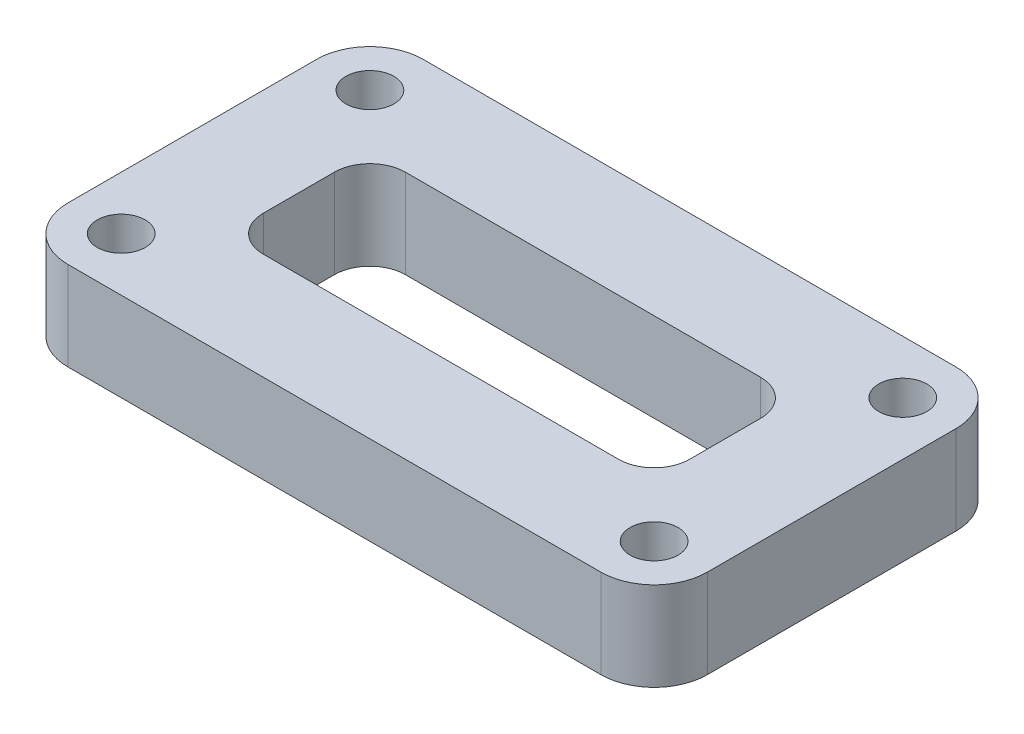
ISO-10303-21;
HEADER;
FILE_DESCRIPTION(('STEP AP214'),'2;1');
FILE_NAME('part.step','',(''),(''),'','','');
FILE_SCHEMA(('AUTOMOTIVE_DESIGN { 1 0 10303 214 1 1 1 1 }'));
ENDSEC;
DATA;
#1=APPLICATION_CONTEXT('core data for automotive mechanical design processes');
#2=APPLICATION_PROTOCOL_DEFINITION('international standard','automotive_design',2000,#1);
#3=PRODUCT_CONTEXT('',#1,'mechanical');
#4=PRODUCT('Part','Part','',(#3));
#5=PRODUCT_RELATED_PRODUCT_CATEGORY('part','',(#4));
#6=PRODUCT_DEFINITION_FORMATION('','',#4);
#7=PRODUCT_DEFINITION_CONTEXT('part definition',#1,'design');
#8=PRODUCT_DEFINITION('design','',#6,#7);
#9=PRODUCT_DEFINITION_SHAPE('','',#8);
#10=(LENGTH_UNIT() NAMED_UNIT(*) SI_UNIT(.MILLI.,.METRE.));
#11=(NAMED_UNIT(*) PLANE_ANGLE_UNIT() SI_UNIT($,.RADIAN.));
#12=(NAMED_UNIT(*) SI_UNIT($,.STERADIAN.) SOLID_ANGLE_UNIT());
#13=UNCERTAINTY_MEASURE_WITH_UNIT(LENGTH_MEASURE(1.E-05),#10,'distance_accuracy_value','');
#14=(GEOMETRIC_REPRESENTATION_CONTEXT(3) GLOBAL_UNCERTAINTY_ASSIGNED_CONTEXT((#13)) GLOBAL_UNIT_ASSIGNED_CONTEXT((#10,
#11,#12)) REPRESENTATION_CONTEXT('',''));
#15=CARTESIAN_POINT('',(0.,0.,0.));
#16=DIRECTION('',(0.,0.,1.));
#17=DIRECTION('',(1.,0.,0.));
#18=AXIS2_PLACEMENT_3D('',#15,#16,#17);
#19=CARTESIAN_POINT('',(0.,5.,0.));
#20=DIRECTION('',(0.,-1.,0.));
#21=DIRECTION('',(0.,0.,-1.));
#22=AXIS2_PLACEMENT_3D('',#19,#20,#21);
#23=PLANE('',#22);
#24=CARTESIAN_POINT('',(3.,5.,-3.));
#25=DIRECTION('',(0.,1.,0.));
#26=DIRECTION('',(0.,0.,-1.));
#27=AXIS2_PLACEMENT_3D('',#24,#25,#26);
#28=CIRCLE('',#27,1.35);
#29=CARTESIAN_POINT('',(3.,5.,-4.35));
#30=VERTEX_POINT('',#29);
#31=EDGE_CURVE('E286',#30,#30,#28,.T.);
#32=ORIENTED_EDGE('',*,*,#31,.F.);
#33=EDGE_LOOP('',(#32));
#34=FACE_BOUND('',#33,.T.);
#35=CARTESIAN_POINT('',(33.,5.,-3.));
#36=DIRECTION('',(0.,1.,0.));
#37=DIRECTION('',(0.,0.,1.));
#38=AXIS2_PLACEMENT_3D('',#35,#36,#37);
#39=CIRCLE('',#38,1.35);
#40=CARTESIAN_POINT('',(33.,5.,-1.65));
#41=VERTEX_POINT('',#40);
#42=EDGE_CURVE('E292',#41,#41,#39,.T.);
#43=ORIENTED_EDGE('',*,*,#42,.F.);
#44=EDGE_LOOP('',(#43));
#45=FACE_BOUND('',#44,.T.);
#46=CARTESIAN_POINT('',(33.,5.,-17.));
#47=DIRECTION('',(0.,1.,0.));
#48=DIRECTION('',(0.,0.,-1.));
#49=AXIS2_PLACEMENT_3D('',#46,#47,#48);
#50=CIRCLE('',#49,1.35);
#51=CARTESIAN_POINT('',(33.,5.,-18.35));
#52=VERTEX_POINT('',#51);
#53=EDGE_CURVE('E298',#52,#52,#50,.T.);
#54=ORIENTED_EDGE('',*,*,#53,.F.);
#55=EDGE_LOOP('',(#54));
#56=FACE_BOUND('',#55,.T.);
#57=CARTESIAN_POINT('',(3.,5.,-17.));
#58=DIRECTION('',(0.,1.,0.));
#59=DIRECTION('',(0.,0.,1.));
#60=AXIS2_PLACEMENT_3D('',#57,#58,#59);
#61=CIRCLE('',#60,1.35);
#62=CARTESIAN_POINT('',(3.,5.,-15.65));
#63=VERTEX_POINT('',#62);
#64=EDGE_CURVE('E179',#63,#63,#61,.T.);
#65=ORIENTED_EDGE('',*,*,#64,.F.);
#66=EDGE_LOOP('',(#65));
#67=FACE_BOUND('',#66,.T.);
#68=DIRECTION('',(-1.,0.,0.));
#69=VECTOR('',#68,1.);
#70=CARTESIAN_POINT('',(0.,5.,-20.));
#71=LINE('',#70,#69);
#72=CARTESIAN_POINT('',(33.,5.,-20.));
#73=VERTEX_POINT('',#72);
#74=CARTESIAN_POINT('',(3.,5.,-20.));
#75=VERTEX_POINT('',#74);
#76=EDGE_CURVE('E188',#73,#75,#71,.T.);
#77=ORIENTED_EDGE('',*,*,#76,.T.);
#78=CARTESIAN_POINT('',(3.,5.,-17.));
#79=DIRECTION('',(0.,-1.,0.));
#80=DIRECTION('',(0.,0.,-1.));
#81=AXIS2_PLACEMENT_3D('',#78,#79,#80);
#82=CIRCLE('',#81,3.);
#83=CARTESIAN_POINT('',(0.,5.,-17.));
#84=VERTEX_POINT('',#83);
#85=EDGE_CURVE('E209',#75,#84,#82,.F.);
#86=ORIENTED_EDGE('',*,*,#85,.T.);
#87=DIRECTION('',(0.,0.,1.));
#88=VECTOR('',#87,1.);
#89=CARTESIAN_POINT('',(0.,5.,0.));
#90=LINE('',#89,#88);
#91=CARTESIAN_POINT('',(0.,5.,-3.));
#92=VERTEX_POINT('',#91);
#93=EDGE_CURVE('E171',#84,#92,#90,.T.);
#94=ORIENTED_EDGE('',*,*,#93,.T.);
#95=CARTESIAN_POINT('',(3.,5.,-3.));
#96=DIRECTION('',(0.,-1.,0.));
#97=DIRECTION('',(0.,0.,-1.));
#98=AXIS2_PLACEMENT_3D('',#95,#96,#97);
#99=CIRCLE('',#98,3.);
#100=CARTESIAN_POINT('',(3.,5.,0.));
#101=VERTEX_POINT('',#100);
#102=EDGE_CURVE('E203',#92,#101,#99,.F.);
#103=ORIENTED_EDGE('',*,*,#102,.T.);
#104=DIRECTION('',(1.,0.,0.));
#105=VECTOR('',#104,1.);
#106=CARTESIAN_POINT('',(0.,5.,0.));
#107=LINE('',#106,#105);
#108=CARTESIAN_POINT('',(33.,5.,0.));
#109=VERTEX_POINT('',#108);
#110=EDGE_CURVE('E306',#101,#109,#107,.T.);
#111=ORIENTED_EDGE('',*,*,#110,.T.);
#112=CARTESIAN_POINT('',(33.,5.,-3.));
#113=DIRECTION('',(0.,-1.,0.));
#114=DIRECTION('',(0.,0.,-1.));
#115=AXIS2_PLACEMENT_3D('',#112,#113,#114);
#116=CIRCLE('',#115,3.);
#117=CARTESIAN_POINT('',(36.,5.,-3.));
#118=VERTEX_POINT('',#117);
#119=EDGE_CURVE('E205',#109,#118,#116,.F.);
#120=ORIENTED_EDGE('',*,*,#119,.T.);
#121=DIRECTION('',(0.,0.,-1.));
#122=VECTOR('',#121,1.);
#123=CARTESIAN_POINT('',(36.,5.,0.));
#124=LINE('',#123,#122);
#125=CARTESIAN_POINT('',(36.,5.,-17.));
#126=VERTEX_POINT('',#125);
#127=EDGE_CURVE('E308',#118,#126,#124,.T.);
#128=ORIENTED_EDGE('',*,*,#127,.T.);
#129=CARTESIAN_POINT('',(33.,5.,-17.));
#130=DIRECTION('',(0.,-1.,0.));
#131=DIRECTION('',(0.,0.,-1.));
#132=AXIS2_PLACEMENT_3D('',#129,#130,#131);
#133=CIRCLE('',#132,3.);
#134=EDGE_CURVE('E207',#126,#73,#133,.F.);
#135=ORIENTED_EDGE('',*,*,#134,.T.);
#136=EDGE_LOOP('',(#77,#86,#94,#103,#111,#120,#128,#135));
#137=FACE_BOUND('',#136,.T.);
#138=DIRECTION('',(1.,0.,0.));
#139=VECTOR('',#138,1.);
#140=CARTESIAN_POINT('',(6.,5.,-6.));
#141=LINE('',#140,#139);
#142=CARTESIAN_POINT('',(8.,5.,-6.));
#143=VERTEX_POINT('',#142);
#144=CARTESIAN_POINT('',(28.,5.,-6.));
#145=VERTEX_POINT('',#144);
#146=EDGE_CURVE('E260',#143,#145,#141,.T.);
#147=ORIENTED_EDGE('',*,*,#146,.F.);
#148=CARTESIAN_POINT('',(8.,5.,-8.));
#149=DIRECTION('',(0.,-1.,0.));
#150=DIRECTION('',(0.,0.,-1.));
#151=AXIS2_PLACEMENT_3D('',#148,#149,#150);
#152=CIRCLE('',#151,2.);
#153=CARTESIAN_POINT('',(6.,5.,-8.));
#154=VERTEX_POINT('',#153);
#155=EDGE_CURVE('E52',#143,#154,#152,.T.);
#156=ORIENTED_EDGE('',*,*,#155,.T.);
#157=DIRECTION('',(0.,0.,1.));
#158=VECTOR('',#157,1.);
#159=CARTESIAN_POINT('',(6.,5.,-6.));
#160=LINE('',#159,#158);
#161=CARTESIAN_POINT('',(6.,5.,-12.));
#162=VERTEX_POINT('',#161);
#163=EDGE_CURVE('E267',#162,#154,#160,.T.);
#164=ORIENTED_EDGE('',*,*,#163,.F.);
#165=CARTESIAN_POINT('',(8.,5.,-12.));
#166=DIRECTION('',(0.,-1.,0.));
#167=DIRECTION('',(0.,0.,-1.));
#168=AXIS2_PLACEMENT_3D('',#165,#166,#167);
#169=CIRCLE('',#168,2.);
#170=CARTESIAN_POINT('',(8.,5.,-14.));
#171=VERTEX_POINT('',#170);
#172=EDGE_CURVE('E11',#162,#171,#169,.T.);
#173=ORIENTED_EDGE('',*,*,#172,.T.);
#174=DIRECTION('',(-1.,0.,0.));
#175=VECTOR('',#174,1.);
#176=CARTESIAN_POINT('',(6.,5.,-14.));
#177=LINE('',#176,#175);
#178=CARTESIAN_POINT('',(28.,5.,-14.));
#179=VERTEX_POINT('',#178);
#180=EDGE_CURVE('E265',#179,#171,#177,.T.);
#181=ORIENTED_EDGE('',*,*,#180,.F.);
#182=CARTESIAN_POINT('',(28.,5.,-12.));
#183=DIRECTION('',(0.,-1.,0.));
#184=DIRECTION('',(0.,0.,-1.));
#185=AXIS2_PLACEMENT_3D('',#182,#183,#184);
#186=CIRCLE('',#185,2.);
#187=CARTESIAN_POINT('',(30.,5.,-12.));
#188=VERTEX_POINT('',#187);
#189=EDGE_CURVE('E246',#179,#188,#186,.T.);
#190=ORIENTED_EDGE('',*,*,#189,.T.);
#191=DIRECTION('',(0.,0.,-1.));
#192=VECTOR('',#191,1.);
#193=CARTESIAN_POINT('',(30.,5.,-6.));
#194=LINE('',#193,#192);
#195=CARTESIAN_POINT('',(30.,5.,-8.));
#196=VERTEX_POINT('',#195);
#197=EDGE_CURVE('E271',#196,#188,#194,.T.);
#198=ORIENTED_EDGE('',*,*,#197,.F.);
#199=CARTESIAN_POINT('',(28.,5.,-8.));
#200=DIRECTION('',(0.,-1.,0.));
#201=DIRECTION('',(0.,0.,-1.));
#202=AXIS2_PLACEMENT_3D('',#199,#200,#201);
#203=CIRCLE('',#202,2.);
#204=EDGE_CURVE('E242',#196,#145,#203,.T.);
#205=ORIENTED_EDGE('',*,*,#204,.T.);
#206=EDGE_LOOP('',(#147,#156,#164,#173,#181,#190,#198,#205));
#207=FACE_BOUND('',#206,.T.);
#208=ADVANCED_FACE('F37',(#34,#45,#56,#67,#137,#207),#23,.F.);
#209=CARTESIAN_POINT('',(0.,0.,0.));
#210=DIRECTION('',(0.,-1.,0.));
#211=DIRECTION('',(0.,0.,-1.));
#212=AXIS2_PLACEMENT_3D('',#209,#210,#211);
#213=PLANE('',#212);
#214=CARTESIAN_POINT('',(33.,0.,-3.));
#215=DIRECTION('',(0.,1.,0.));
#216=DIRECTION('',(0.,0.,1.));
#217=AXIS2_PLACEMENT_3D('',#214,#215,#216);
#218=CIRCLE('',#217,1.35);
#219=CARTESIAN_POINT('',(33.,0.,-1.65));
#220=VERTEX_POINT('',#219);
#221=EDGE_CURVE('E289',#220,#220,#218,.T.);
#222=ORIENTED_EDGE('',*,*,#221,.T.);
#223=EDGE_LOOP('',(#222));
#224=FACE_BOUND('',#223,.T.);
#225=CARTESIAN_POINT('',(3.,0.,-17.));
#226=DIRECTION('',(0.,1.,0.));
#227=DIRECTION('',(0.,0.,1.));
#228=AXIS2_PLACEMENT_3D('',#225,#226,#227);
#229=CIRCLE('',#228,1.35);
#230=CARTESIAN_POINT('',(3.,0.,-15.65));
#231=VERTEX_POINT('',#230);
#232=EDGE_CURVE('E185',#231,#231,#229,.T.);
#233=ORIENTED_EDGE('',*,*,#232,.T.);
#234=EDGE_LOOP('',(#233));
#235=FACE_BOUND('',#234,.T.);
#236=DIRECTION('',(0.,0.,1.));
#237=VECTOR('',#236,1.);
#238=CARTESIAN_POINT('',(0.,0.,0.));
#239=LINE('',#238,#237);
#240=CARTESIAN_POINT('',(0.,0.,-17.));
#241=VERTEX_POINT('',#240);
#242=CARTESIAN_POINT('',(0.,0.,-3.));
#243=VERTEX_POINT('',#242);
#244=EDGE_CURVE('E168',#241,#243,#239,.T.);
#245=ORIENTED_EDGE('',*,*,#244,.F.);
#246=CARTESIAN_POINT('',(3.,0.,-17.));
#247=DIRECTION('',(0.,-1.,0.));
#248=DIRECTION('',(0.,0.,-1.));
#249=AXIS2_PLACEMENT_3D('',#246,#247,#248);
#250=CIRCLE('',#249,3.);
#251=CARTESIAN_POINT('',(3.,0.,-20.));
#252=VERTEX_POINT('',#251);
#253=EDGE_CURVE('E151',#241,#252,#250,.T.);
#254=ORIENTED_EDGE('',*,*,#253,.T.);
#255=DIRECTION('',(-1.,0.,0.));
#256=VECTOR('',#255,1.);
#257=CARTESIAN_POINT('',(0.,0.,-20.));
#258=LINE('',#257,#256);
#259=CARTESIAN_POINT('',(33.,0.,-20.));
#260=VERTEX_POINT('',#259);
#261=EDGE_CURVE('E193',#260,#252,#258,.T.);
#262=ORIENTED_EDGE('',*,*,#261,.F.);
#263=CARTESIAN_POINT('',(33.,0.,-17.));
#264=DIRECTION('',(0.,-1.,0.));
#265=DIRECTION('',(0.,0.,-1.));
#266=AXIS2_PLACEMENT_3D('',#263,#264,#265);
#267=CIRCLE('',#266,3.);
#268=CARTESIAN_POINT('',(36.,0.,-17.));
#269=VERTEX_POINT('',#268);
#270=EDGE_CURVE('E162',#260,#269,#267,.T.);
#271=ORIENTED_EDGE('',*,*,#270,.T.);
#272=DIRECTION('',(0.,0.,-1.));
#273=VECTOR('',#272,1.);
#274=CARTESIAN_POINT('',(36.,0.,0.));
#275=LINE('',#274,#273);
#276=CARTESIAN_POINT('',(36.,0.,-3.));
#277=VERTEX_POINT('',#276);
#278=EDGE_CURVE('E182',#277,#269,#275,.T.);
#279=ORIENTED_EDGE('',*,*,#278,.F.);
#280=CARTESIAN_POINT('',(33.,0.,-3.));
#281=DIRECTION('',(0.,-1.,0.));
#282=DIRECTION('',(0.,0.,-1.));
#283=AXIS2_PLACEMENT_3D('',#280,#281,#282);
#284=CIRCLE('',#283,3.);
#285=CARTESIAN_POINT('',(33.,0.,0.));
#286=VERTEX_POINT('',#285);
#287=EDGE_CURVE('E197',#277,#286,#284,.T.);
#288=ORIENTED_EDGE('',*,*,#287,.T.);
#289=DIRECTION('',(1.,0.,0.));
#290=VECTOR('',#289,1.);
#291=CARTESIAN_POINT('',(0.,0.,0.));
#292=LINE('',#291,#290);
#293=CARTESIAN_POINT('',(3.,0.,0.));
#294=VERTEX_POINT('',#293);
#295=EDGE_CURVE('E178',#294,#286,#292,.T.);
#296=ORIENTED_EDGE('',*,*,#295,.F.);
#297=CARTESIAN_POINT('',(3.,0.,-3.));
#298=DIRECTION('',(0.,-1.,0.));
#299=DIRECTION('',(0.,0.,-1.));
#300=AXIS2_PLACEMENT_3D('',#297,#298,#299);
#301=CIRCLE('',#300,3.);
#302=EDGE_CURVE('E172',#294,#243,#301,.T.);
#303=ORIENTED_EDGE('',*,*,#302,.T.);
#304=EDGE_LOOP('',(#245,#254,#262,#271,#279,#288,#296,#303));
#305=FACE_BOUND('',#304,.T.);
#306=CARTESIAN_POINT('',(33.,0.,-17.));
#307=DIRECTION('',(0.,1.,0.));
#308=DIRECTION('',(0.,0.,-1.));
#309=AXIS2_PLACEMENT_3D('',#306,#307,#308);
#310=CIRCLE('',#309,1.35);
#311=CARTESIAN_POINT('',(33.,0.,-18.35));
#312=VERTEX_POINT('',#311);
#313=EDGE_CURVE('E295',#312,#312,#310,.T.);
#314=ORIENTED_EDGE('',*,*,#313,.T.);
#315=EDGE_LOOP('',(#314));
#316=FACE_BOUND('',#315,.T.);
#317=CARTESIAN_POINT('',(3.,0.,-3.));
#318=DIRECTION('',(0.,1.,0.));
#319=DIRECTION('',(0.,0.,-1.));
#320=AXIS2_PLACEMENT_3D('',#317,#318,#319);
#321=CIRCLE('',#320,1.35);
#322=CARTESIAN_POINT('',(3.,0.,-4.35));
#323=VERTEX_POINT('',#322);
#324=EDGE_CURVE('E273',#323,#323,#321,.T.);
#325=ORIENTED_EDGE('',*,*,#324,.T.);
#326=EDGE_LOOP('',(#325));
#327=FACE_BOUND('',#326,.T.);
#328=DIRECTION('',(-1.,0.,0.));
#329=VECTOR('',#328,1.);
#330=CARTESIAN_POINT('',(6.,0.,-14.));
#331=LINE('',#330,#329);
#332=CARTESIAN_POINT('',(28.,0.,-14.));
#333=VERTEX_POINT('',#332);
#334=CARTESIAN_POINT('',(8.,0.,-14.));
#335=VERTEX_POINT('',#334);
#336=EDGE_CURVE('E255',#333,#335,#331,.T.);
#337=ORIENTED_EDGE('',*,*,#336,.T.);
#338=CARTESIAN_POINT('',(8.,0.,-12.));
#339=DIRECTION('',(0.,-1.,0.));
#340=DIRECTION('',(0.,0.,-1.));
#341=AXIS2_PLACEMENT_3D('',#338,#339,#340);
#342=CIRCLE('',#341,2.);
#343=CARTESIAN_POINT('',(6.,0.,-12.));
#344=VERTEX_POINT('',#343);
#345=EDGE_CURVE('E45',#335,#344,#342,.F.);
#346=ORIENTED_EDGE('',*,*,#345,.T.);
#347=DIRECTION('',(0.,0.,1.));
#348=VECTOR('',#347,1.);
#349=CARTESIAN_POINT('',(6.,0.,-6.));
#350=LINE('',#349,#348);
#351=CARTESIAN_POINT('',(6.,0.,-8.));
#352=VERTEX_POINT('',#351);
#353=EDGE_CURVE('E253',#344,#352,#350,.T.);
#354=ORIENTED_EDGE('',*,*,#353,.T.);
#355=CARTESIAN_POINT('',(8.,0.,-8.));
#356=DIRECTION('',(0.,-1.,0.));
#357=DIRECTION('',(0.,0.,-1.));
#358=AXIS2_PLACEMENT_3D('',#355,#356,#357);
#359=CIRCLE('',#358,2.);
#360=CARTESIAN_POINT('',(8.,0.,-6.));
#361=VERTEX_POINT('',#360);
#362=EDGE_CURVE('E248',#352,#361,#359,.F.);
#363=ORIENTED_EDGE('',*,*,#362,.T.);
#364=DIRECTION('',(1.,0.,0.));
#365=VECTOR('',#364,1.);
#366=CARTESIAN_POINT('',(6.,0.,-6.));
#367=LINE('',#366,#365);
#368=CARTESIAN_POINT('',(28.,0.,-6.));
#369=VERTEX_POINT('',#368);
#370=EDGE_CURVE('E279',#361,#369,#367,.T.);
#371=ORIENTED_EDGE('',*,*,#370,.T.);
#372=CARTESIAN_POINT('',(28.,0.,-8.));
#373=DIRECTION('',(0.,-1.,0.));
#374=DIRECTION('',(0.,0.,-1.));
#375=AXIS2_PLACEMENT_3D('',#372,#373,#374);
#376=CIRCLE('',#375,2.);
#377=CARTESIAN_POINT('',(30.,0.,-8.));
#378=VERTEX_POINT('',#377);
#379=EDGE_CURVE('E240',#369,#378,#376,.F.);
#380=ORIENTED_EDGE('',*,*,#379,.T.);
#381=DIRECTION('',(0.,0.,-1.));
#382=VECTOR('',#381,1.);
#383=CARTESIAN_POINT('',(30.,0.,-6.));
#384=LINE('',#383,#382);
#385=CARTESIAN_POINT('',(30.,0.,-12.));
#386=VERTEX_POINT('',#385);
#387=EDGE_CURVE('E282',#378,#386,#384,.T.);
#388=ORIENTED_EDGE('',*,*,#387,.T.);
#389=CARTESIAN_POINT('',(28.,0.,-12.));
#390=DIRECTION('',(0.,-1.,0.));
#391=DIRECTION('',(0.,0.,-1.));
#392=AXIS2_PLACEMENT_3D('',#389,#390,#391);
#393=CIRCLE('',#392,2.);
#394=EDGE_CURVE('E244',#386,#333,#393,.F.);
#395=ORIENTED_EDGE('',*,*,#394,.T.);
#396=EDGE_LOOP('',(#337,#346,#354,#363,#371,#380,#388,#395));
#397=FACE_BOUND('',#396,.T.);
#398=ADVANCED_FACE('F175',(#224,#235,#305,#316,#327,#397),#213,.T.);
#399=CARTESIAN_POINT('',(0.,5.,0.));
#400=DIRECTION('',(1.,0.,0.));
#401=DIRECTION('',(0.,0.,-1.));
#402=AXIS2_PLACEMENT_3D('',#399,#400,#401);
#403=PLANE('',#402);
#404=ORIENTED_EDGE('',*,*,#93,.F.);
#405=DIRECTION('',(0.,-1.,0.));
#406=VECTOR('',#405,1.);
#407=CARTESIAN_POINT('',(0.,5.,-17.));
#408=LINE('',#407,#406);
#409=EDGE_CURVE('E155',#84,#241,#408,.T.);
#410=ORIENTED_EDGE('',*,*,#409,.T.);
#411=ORIENTED_EDGE('',*,*,#244,.T.);
#412=DIRECTION('',(0.,-1.,0.));
#413=VECTOR('',#412,1.);
#414=CARTESIAN_POINT('',(0.,5.,-3.));
#415=LINE('',#414,#413);
#416=EDGE_CURVE('E173',#243,#92,#415,.F.);
#417=ORIENTED_EDGE('',*,*,#416,.T.);
#418=EDGE_LOOP('',(#404,#410,#411,#417));
#419=FACE_BOUND('',#418,.T.);
#420=ADVANCED_FACE('F167',(#419),#403,.F.);
#421=CARTESIAN_POINT('',(0.,5.,0.));
#422=DIRECTION('',(0.,0.,-1.));
#423=DIRECTION('',(-1.,0.,0.));
#424=AXIS2_PLACEMENT_3D('',#421,#422,#423);
#425=PLANE('',#424);
#426=ORIENTED_EDGE('',*,*,#295,.T.);
#427=DIRECTION('',(0.,-1.,0.));
#428=VECTOR('',#427,1.);
#429=CARTESIAN_POINT('',(33.,5.,0.));
#430=LINE('',#429,#428);
#431=EDGE_CURVE('E219',#286,#109,#430,.F.);
#432=ORIENTED_EDGE('',*,*,#431,.T.);
#433=ORIENTED_EDGE('',*,*,#110,.F.);
#434=DIRECTION('',(0.,-1.,0.));
#435=VECTOR('',#434,1.);
#436=CARTESIAN_POINT('',(3.,5.,0.));
#437=LINE('',#436,#435);
#438=EDGE_CURVE('E216',#101,#294,#437,.T.);
#439=ORIENTED_EDGE('',*,*,#438,.T.);
#440=EDGE_LOOP('',(#426,#432,#433,#439));
#441=FACE_BOUND('',#440,.T.);
#442=ADVANCED_FACE('F330',(#441),#425,.F.);
#443=CARTESIAN_POINT('',(36.,5.,0.));
#444=DIRECTION('',(-1.,0.,0.));
#445=DIRECTION('',(0.,0.,1.));
#446=AXIS2_PLACEMENT_3D('',#443,#444,#445);
#447=PLANE('',#446);
#448=ORIENTED_EDGE('',*,*,#278,.T.);
#449=DIRECTION('',(0.,-1.,0.));
#450=VECTOR('',#449,1.);
#451=CARTESIAN_POINT('',(36.,5.,-17.));
#452=LINE('',#451,#450);
#453=EDGE_CURVE('E214',#269,#126,#452,.F.);
#454=ORIENTED_EDGE('',*,*,#453,.T.);
#455=ORIENTED_EDGE('',*,*,#127,.F.);
#456=DIRECTION('',(0.,-1.,0.));
#457=VECTOR('',#456,1.);
#458=CARTESIAN_POINT('',(36.,5.,-3.));
#459=LINE('',#458,#457);
#460=EDGE_CURVE('E211',#118,#277,#459,.T.);
#461=ORIENTED_EDGE('',*,*,#460,.T.);
#462=EDGE_LOOP('',(#448,#454,#455,#461));
#463=FACE_BOUND('',#462,.T.);
#464=ADVANCED_FACE('F323',(#463),#447,.F.);
#465=CARTESIAN_POINT('',(0.,5.,-20.));
#466=DIRECTION('',(0.,0.,1.));
#467=DIRECTION('',(1.,0.,0.));
#468=AXIS2_PLACEMENT_3D('',#465,#466,#467);
#469=PLANE('',#468);
#470=ORIENTED_EDGE('',*,*,#261,.T.);
#471=DIRECTION('',(0.,-1.,0.));
#472=VECTOR('',#471,1.);
#473=CARTESIAN_POINT('',(3.,5.,-20.));
#474=LINE('',#473,#472);
#475=EDGE_CURVE('E156',#252,#75,#474,.F.);
#476=ORIENTED_EDGE('',*,*,#475,.T.);
#477=ORIENTED_EDGE('',*,*,#76,.F.);
#478=DIRECTION('',(0.,-1.,0.));
#479=VECTOR('',#478,1.);
#480=CARTESIAN_POINT('',(33.,5.,-20.));
#481=LINE('',#480,#479);
#482=EDGE_CURVE('E161',#73,#260,#481,.T.);
#483=ORIENTED_EDGE('',*,*,#482,.T.);
#484=EDGE_LOOP('',(#470,#476,#477,#483));
#485=FACE_BOUND('',#484,.T.);
#486=ADVANCED_FACE('F317',(#485),#469,.F.);
#487=CARTESIAN_POINT('',(3.,5.,-17.));
#488=DIRECTION('',(0.,-1.,0.));
#489=DIRECTION('',(0.,0.,-1.));
#490=AXIS2_PLACEMENT_3D('',#487,#488,#489);
#491=CYLINDRICAL_SURFACE('',#490,1.35);
#492=ORIENTED_EDGE('',*,*,#64,.T.);
#493=EDGE_LOOP('',(#492));
#494=FACE_BOUND('',#493,.T.);
#495=ORIENTED_EDGE('',*,*,#232,.F.);
#496=EDGE_LOOP('',(#495));
#497=FACE_BOUND('',#496,.T.);
#498=ADVANCED_FACE('F358',(#494,#497),#491,.F.);
#499=CARTESIAN_POINT('',(33.,5.,-17.));
#500=DIRECTION('',(0.,-1.,0.));
#501=DIRECTION('',(0.,0.,-1.));
#502=AXIS2_PLACEMENT_3D('',#499,#500,#501);
#503=CYLINDRICAL_SURFACE('',#502,1.35);
#504=ORIENTED_EDGE('',*,*,#53,.T.);
#505=EDGE_LOOP('',(#504));
#506=FACE_BOUND('',#505,.T.);
#507=ORIENTED_EDGE('',*,*,#313,.F.);
#508=EDGE_LOOP('',(#507));
#509=FACE_BOUND('',#508,.T.);
#510=ADVANCED_FACE('F522',(#506,#509),#503,.F.);
#511=CARTESIAN_POINT('',(33.,5.,-3.));
#512=DIRECTION('',(0.,-1.,0.));
#513=DIRECTION('',(0.,0.,-1.));
#514=AXIS2_PLACEMENT_3D('',#511,#512,#513);
#515=CYLINDRICAL_SURFACE('',#514,1.35);
#516=ORIENTED_EDGE('',*,*,#42,.T.);
#517=EDGE_LOOP('',(#516));
#518=FACE_BOUND('',#517,.T.);
#519=ORIENTED_EDGE('',*,*,#221,.F.);
#520=EDGE_LOOP('',(#519));
#521=FACE_BOUND('',#520,.T.);
#522=ADVANCED_FACE('F512',(#518,#521),#515,.F.);
#523=CARTESIAN_POINT('',(3.,5.,-3.));
#524=DIRECTION('',(0.,-1.,0.));
#525=DIRECTION('',(0.,0.,-1.));
#526=AXIS2_PLACEMENT_3D('',#523,#524,#525);
#527=CYLINDRICAL_SURFACE('',#526,1.35);
#528=ORIENTED_EDGE('',*,*,#31,.T.);
#529=EDGE_LOOP('',(#528));
#530=FACE_BOUND('',#529,.T.);
#531=ORIENTED_EDGE('',*,*,#324,.F.);
#532=EDGE_LOOP('',(#531));
#533=FACE_BOUND('',#532,.T.);
#534=ADVANCED_FACE('F408',(#530,#533),#527,.F.);
#535=CARTESIAN_POINT('',(6.,5.,-6.));
#536=DIRECTION('',(0.,0.,-1.));
#537=DIRECTION('',(-1.,0.,0.));
#538=AXIS2_PLACEMENT_3D('',#535,#536,#537);
#539=PLANE('',#538);
#540=ORIENTED_EDGE('',*,*,#146,.T.);
#541=DIRECTION('',(0.,-1.,0.));
#542=VECTOR('',#541,1.);
#543=CARTESIAN_POINT('',(28.,0.,-6.));
#544=LINE('',#543,#542);
#545=EDGE_CURVE('E223',#145,#369,#544,.T.);
#546=ORIENTED_EDGE('',*,*,#545,.T.);
#547=ORIENTED_EDGE('',*,*,#370,.F.);
#548=DIRECTION('',(0.,-1.,0.));
#549=VECTOR('',#548,1.);
#550=CARTESIAN_POINT('',(8.,5.,-6.));
#551=LINE('',#550,#549);
#552=EDGE_CURVE('E221',#361,#143,#551,.F.);
#553=ORIENTED_EDGE('',*,*,#552,.T.);
#554=EDGE_LOOP('',(#540,#546,#547,#553));
#555=FACE_BOUND('',#554,.T.);
#556=ADVANCED_FACE('F402',(#555),#539,.T.);
#557=CARTESIAN_POINT('',(30.,5.,-6.));
#558=DIRECTION('',(-1.,0.,0.));
#559=DIRECTION('',(0.,0.,1.));
#560=AXIS2_PLACEMENT_3D('',#557,#558,#559);
#561=PLANE('',#560);
#562=ORIENTED_EDGE('',*,*,#387,.F.);
#563=DIRECTION('',(0.,-1.,0.));
#564=VECTOR('',#563,1.);
#565=CARTESIAN_POINT('',(30.,5.,-8.));
#566=LINE('',#565,#564);
#567=EDGE_CURVE('E229',#378,#196,#566,.F.);
#568=ORIENTED_EDGE('',*,*,#567,.T.);
#569=ORIENTED_EDGE('',*,*,#197,.T.);
#570=DIRECTION('',(0.,-1.,0.));
#571=VECTOR('',#570,1.);
#572=CARTESIAN_POINT('',(30.,0.,-12.));
#573=LINE('',#572,#571);
#574=EDGE_CURVE('E226',#188,#386,#573,.T.);
#575=ORIENTED_EDGE('',*,*,#574,.T.);
#576=EDGE_LOOP('',(#562,#568,#569,#575));
#577=FACE_BOUND('',#576,.T.);
#578=ADVANCED_FACE('F407',(#577),#561,.T.);
#579=CARTESIAN_POINT('',(6.,5.,-14.));
#580=DIRECTION('',(0.,0.,1.));
#581=DIRECTION('',(1.,0.,0.));
#582=AXIS2_PLACEMENT_3D('',#579,#580,#581);
#583=PLANE('',#582);
#584=ORIENTED_EDGE('',*,*,#336,.F.);
#585=DIRECTION('',(0.,-1.,0.));
#586=VECTOR('',#585,1.);
#587=CARTESIAN_POINT('',(28.,5.,-14.));
#588=LINE('',#587,#586);
#589=EDGE_CURVE('E234',#333,#179,#588,.F.);
#590=ORIENTED_EDGE('',*,*,#589,.T.);
#591=ORIENTED_EDGE('',*,*,#180,.T.);
#592=DIRECTION('',(0.,-1.,0.));
#593=VECTOR('',#592,1.);
#594=CARTESIAN_POINT('',(8.,0.,-14.));
#595=LINE('',#594,#593);
#596=EDGE_CURVE('E231',#171,#335,#595,.T.);
#597=ORIENTED_EDGE('',*,*,#596,.T.);
#598=EDGE_LOOP('',(#584,#590,#591,#597));
#599=FACE_BOUND('',#598,.T.);
#600=ADVANCED_FACE('F269',(#599),#583,.T.);
#601=CARTESIAN_POINT('',(6.,5.,-6.));
#602=DIRECTION('',(1.,0.,0.));
#603=DIRECTION('',(0.,0.,-1.));
#604=AXIS2_PLACEMENT_3D('',#601,#602,#603);
#605=PLANE('',#604);
#606=ORIENTED_EDGE('',*,*,#163,.T.);
#607=DIRECTION('',(0.,-1.,0.));
#608=VECTOR('',#607,1.);
#609=CARTESIAN_POINT('',(6.,0.,-8.));
#610=LINE('',#609,#608);
#611=EDGE_CURVE('E237',#154,#352,#610,.T.);
#612=ORIENTED_EDGE('',*,*,#611,.T.);
#613=ORIENTED_EDGE('',*,*,#353,.F.);
#614=DIRECTION('',(0.,-1.,0.));
#615=VECTOR('',#614,1.);
#616=CARTESIAN_POINT('',(6.,5.,-12.));
#617=LINE('',#616,#615);
#618=EDGE_CURVE('E59',#344,#162,#617,.F.);
#619=ORIENTED_EDGE('',*,*,#618,.T.);
#620=EDGE_LOOP('',(#606,#612,#613,#619));
#621=FACE_BOUND('',#620,.T.);
#622=ADVANCED_FACE('F258',(#621),#605,.T.);
#623=CARTESIAN_POINT('',(3.,5.,-17.));
#624=DIRECTION('',(0.,-1.,0.));
#625=DIRECTION('',(0.,0.,-1.));
#626=AXIS2_PLACEMENT_3D('',#623,#624,#625);
#627=CYLINDRICAL_SURFACE('',#626,3.);
#628=ORIENTED_EDGE('',*,*,#85,.F.);
#629=ORIENTED_EDGE('',*,*,#475,.F.);
#630=ORIENTED_EDGE('',*,*,#253,.F.);
#631=ORIENTED_EDGE('',*,*,#409,.F.);
#632=EDGE_LOOP('',(#628,#629,#630,#631));
#633=FACE_BOUND('',#632,.T.);
#634=ADVANCED_FACE('F154',(#633),#627,.T.);
#635=CARTESIAN_POINT('',(33.,5.,-17.));
#636=DIRECTION('',(0.,-1.,0.));
#637=DIRECTION('',(0.,0.,-1.));
#638=AXIS2_PLACEMENT_3D('',#635,#636,#637);
#639=CYLINDRICAL_SURFACE('',#638,3.);
#640=ORIENTED_EDGE('',*,*,#134,.F.);
#641=ORIENTED_EDGE('',*,*,#453,.F.);
#642=ORIENTED_EDGE('',*,*,#270,.F.);
#643=ORIENTED_EDGE('',*,*,#482,.F.);
#644=EDGE_LOOP('',(#640,#641,#642,#643));
#645=FACE_BOUND('',#644,.T.);
#646=ADVANCED_FACE('F319',(#645),#639,.T.);
#647=CARTESIAN_POINT('',(33.,5.,-3.));
#648=DIRECTION('',(0.,-1.,0.));
#649=DIRECTION('',(0.,0.,-1.));
#650=AXIS2_PLACEMENT_3D('',#647,#648,#649);
#651=CYLINDRICAL_SURFACE('',#650,3.);
#652=ORIENTED_EDGE('',*,*,#119,.F.);
#653=ORIENTED_EDGE('',*,*,#431,.F.);
#654=ORIENTED_EDGE('',*,*,#287,.F.);
#655=ORIENTED_EDGE('',*,*,#460,.F.);
#656=EDGE_LOOP('',(#652,#653,#654,#655));
#657=FACE_BOUND('',#656,.T.);
#658=ADVANCED_FACE('F327',(#657),#651,.T.);
#659=CARTESIAN_POINT('',(3.,5.,-3.));
#660=DIRECTION('',(0.,-1.,0.));
#661=DIRECTION('',(0.,0.,-1.));
#662=AXIS2_PLACEMENT_3D('',#659,#660,#661);
#663=CYLINDRICAL_SURFACE('',#662,3.);
#664=ORIENTED_EDGE('',*,*,#102,.F.);
#665=ORIENTED_EDGE('',*,*,#416,.F.);
#666=ORIENTED_EDGE('',*,*,#302,.F.);
#667=ORIENTED_EDGE('',*,*,#438,.F.);
#668=EDGE_LOOP('',(#664,#665,#666,#667));
#669=FACE_BOUND('',#668,.T.);
#670=ADVANCED_FACE('F335',(#669),#663,.T.);
#671=CARTESIAN_POINT('',(28.,5.,-8.));
#672=DIRECTION('',(0.,1.,0.));
#673=DIRECTION('',(0.,0.,1.));
#674=AXIS2_PLACEMENT_3D('',#671,#672,#673);
#675=CYLINDRICAL_SURFACE('',#674,2.);
#676=ORIENTED_EDGE('',*,*,#204,.F.);
#677=ORIENTED_EDGE('',*,*,#567,.F.);
#678=ORIENTED_EDGE('',*,*,#379,.F.);
#679=ORIENTED_EDGE('',*,*,#545,.F.);
#680=EDGE_LOOP('',(#676,#677,#678,#679));
#681=FACE_BOUND('',#680,.T.);
#682=ADVANCED_FACE('F337',(#681),#675,.F.);
#683=CARTESIAN_POINT('',(28.,5.,-12.));
#684=DIRECTION('',(0.,1.,0.));
#685=DIRECTION('',(0.,0.,1.));
#686=AXIS2_PLACEMENT_3D('',#683,#684,#685);
#687=CYLINDRICAL_SURFACE('',#686,2.);
#688=ORIENTED_EDGE('',*,*,#189,.F.);
#689=ORIENTED_EDGE('',*,*,#589,.F.);
#690=ORIENTED_EDGE('',*,*,#394,.F.);
#691=ORIENTED_EDGE('',*,*,#574,.F.);
#692=EDGE_LOOP('',(#688,#689,#690,#691));
#693=FACE_BOUND('',#692,.T.);
#694=ADVANCED_FACE('F343',(#693),#687,.F.);
#695=CARTESIAN_POINT('',(8.,5.,-8.));
#696=DIRECTION('',(0.,1.,0.));
#697=DIRECTION('',(0.,0.,1.));
#698=AXIS2_PLACEMENT_3D('',#695,#696,#697);
#699=CYLINDRICAL_SURFACE('',#698,2.);
#700=ORIENTED_EDGE('',*,*,#155,.F.);
#701=ORIENTED_EDGE('',*,*,#552,.F.);
#702=ORIENTED_EDGE('',*,*,#362,.F.);
#703=ORIENTED_EDGE('',*,*,#611,.F.);
#704=EDGE_LOOP('',(#700,#701,#702,#703));
#705=FACE_BOUND('',#704,.T.);
#706=ADVANCED_FACE('F450',(#705),#699,.F.);
#707=CARTESIAN_POINT('',(8.,5.,-12.));
#708=DIRECTION('',(0.,1.,0.));
#709=DIRECTION('',(0.,0.,1.));
#710=AXIS2_PLACEMENT_3D('',#707,#708,#709);
#711=CYLINDRICAL_SURFACE('',#710,2.);
#712=ORIENTED_EDGE('',*,*,#172,.F.);
#713=ORIENTED_EDGE('',*,*,#618,.F.);
#714=ORIENTED_EDGE('',*,*,#345,.F.);
#715=ORIENTED_EDGE('',*,*,#596,.F.);
#716=EDGE_LOOP('',(#712,#713,#714,#715));
#717=FACE_BOUND('',#716,.T.);
#718=ADVANCED_FACE('F39',(#717),#711,.F.);
#719=CLOSED_SHELL('',(#208,#398,#420,#442,#464,#486,#498,#510,#522,#534,#556,#578,#600,#622,
#634,#646,#658,#670,#682,#694,#706,#718));
#720=MANIFOLD_SOLID_BREP('B2',#719);
#721=ADVANCED_BREP_SHAPE_REPRESENTATION('',(#18,#720),#14);
#722=SHAPE_DEFINITION_REPRESENTATION(#9,#721);
ENDSEC;
END-ISO-10303-21;
